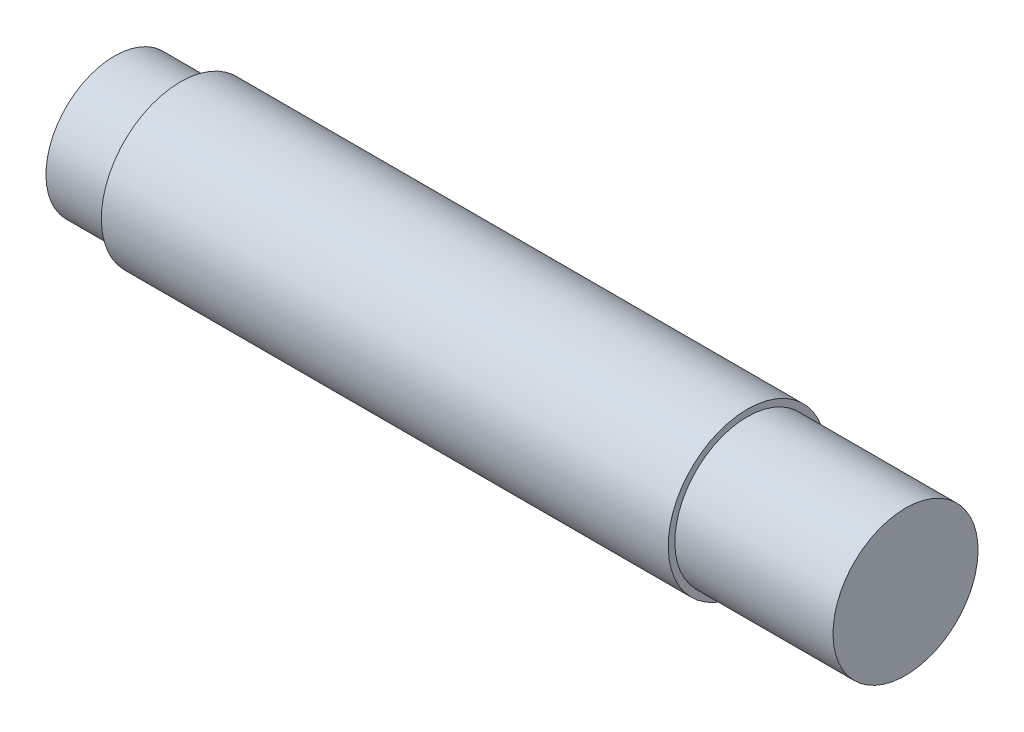
ISO-10303-21;
HEADER;
FILE_DESCRIPTION(('STEP AP214'),'2;1');
FILE_NAME('part.step','',(''),(''),'','','');
FILE_SCHEMA(('AUTOMOTIVE_DESIGN { 1 0 10303 214 1 1 1 1 }'));
ENDSEC;
DATA;
#1=APPLICATION_CONTEXT('core data for automotive mechanical design processes');
#2=APPLICATION_PROTOCOL_DEFINITION('international standard','automotive_design',2000,#1);
#3=PRODUCT_CONTEXT('',#1,'mechanical');
#4=PRODUCT('Part','Part','',(#3));
#5=PRODUCT_RELATED_PRODUCT_CATEGORY('part','',(#4));
#6=PRODUCT_DEFINITION_FORMATION('','',#4);
#7=PRODUCT_DEFINITION_CONTEXT('part definition',#1,'design');
#8=PRODUCT_DEFINITION('design','',#6,#7);
#9=PRODUCT_DEFINITION_SHAPE('','',#8);
#10=(LENGTH_UNIT() NAMED_UNIT(*) SI_UNIT(.MILLI.,.METRE.));
#11=(NAMED_UNIT(*) PLANE_ANGLE_UNIT() SI_UNIT($,.RADIAN.));
#12=(NAMED_UNIT(*) SI_UNIT($,.STERADIAN.) SOLID_ANGLE_UNIT());
#13=UNCERTAINTY_MEASURE_WITH_UNIT(LENGTH_MEASURE(1.E-05),#10,'distance_accuracy_value','');
#14=(GEOMETRIC_REPRESENTATION_CONTEXT(3) GLOBAL_UNCERTAINTY_ASSIGNED_CONTEXT((#13)) GLOBAL_UNIT_ASSIGNED_CONTEXT((#10,
#11,#12)) REPRESENTATION_CONTEXT('',''));
#15=CARTESIAN_POINT('',(0.,0.,0.));
#16=DIRECTION('',(0.,0.,1.));
#17=DIRECTION('',(1.,0.,0.));
#18=AXIS2_PLACEMENT_3D('',#15,#16,#17);
#19=CARTESIAN_POINT('',(0.,5.2,0.));
#20=DIRECTION('',(-1.,0.,0.));
#21=DIRECTION('',(0.,0.707106781186548,0.707106781186548));
#22=AXIS2_PLACEMENT_3D('',#19,#20,#21);
#23=PLANE('',#22);
#24=CARTESIAN_POINT('',(0.,0.,0.));
#25=DIRECTION('',(1.,0.,0.));
#26=DIRECTION('',(0.,0.,-1.));
#27=AXIS2_PLACEMENT_3D('',#24,#25,#26);
#28=CIRCLE('',#27,5.2);
#29=CARTESIAN_POINT('',(0.,5.2,0.));
#30=VERTEX_POINT('',#29);
#31=EDGE_CURVE('E11',#30,#30,#28,.T.);
#32=ORIENTED_EDGE('',*,*,#31,.F.);
#33=EDGE_LOOP('',(#32));
#34=FACE_BOUND('',#33,.T.);
#35=ADVANCED_FACE('F17',(#34),#23,.T.);
#36=CARTESIAN_POINT('',(2.5,0.,0.));
#37=DIRECTION('',(1.,0.,0.));
#38=DIRECTION('',(0.,1.,0.));
#39=AXIS2_PLACEMENT_3D('',#36,#37,#38);
#40=CYLINDRICAL_SURFACE('',#39,5.2);
#41=ORIENTED_EDGE('',*,*,#31,.T.);
#42=EDGE_LOOP('',(#41));
#43=FACE_BOUND('',#42,.T.);
#44=CARTESIAN_POINT('',(5.,0.,0.));
#45=DIRECTION('',(1.,0.,0.));
#46=DIRECTION('',(0.,0.,-1.));
#47=AXIS2_PLACEMENT_3D('',#44,#45,#46);
#48=CIRCLE('',#47,5.2);
#49=CARTESIAN_POINT('',(5.,5.2,0.));
#50=VERTEX_POINT('',#49);
#51=EDGE_CURVE('E27',#50,#50,#48,.T.);
#52=ORIENTED_EDGE('',*,*,#51,.F.);
#53=EDGE_LOOP('',(#52));
#54=FACE_BOUND('',#53,.T.);
#55=ADVANCED_FACE('F64',(#43,#54),#40,.T.);
#56=CARTESIAN_POINT('',(5.,6.,0.));
#57=DIRECTION('',(-1.,0.,0.));
#58=DIRECTION('',(0.,0.707106781186548,0.707106781186548));
#59=AXIS2_PLACEMENT_3D('',#56,#57,#58);
#60=PLANE('',#59);
#61=ORIENTED_EDGE('',*,*,#51,.T.);
#62=EDGE_LOOP('',(#61));
#63=FACE_BOUND('',#62,.T.);
#64=CARTESIAN_POINT('',(5.,0.,0.));
#65=DIRECTION('',(1.,0.,0.));
#66=DIRECTION('',(0.,0.,-1.));
#67=AXIS2_PLACEMENT_3D('',#64,#65,#66);
#68=CIRCLE('',#67,6.);
#69=CARTESIAN_POINT('',(5.,6.,0.));
#70=VERTEX_POINT('',#69);
#71=EDGE_CURVE('E54',#70,#70,#68,.T.);
#72=ORIENTED_EDGE('',*,*,#71,.F.);
#73=EDGE_LOOP('',(#72));
#74=FACE_BOUND('',#73,.T.);
#75=ADVANCED_FACE('F61',(#63,#74),#60,.T.);
#76=CARTESIAN_POINT('',(26.5,0.,0.));
#77=DIRECTION('',(1.,0.,0.));
#78=DIRECTION('',(0.,1.,0.));
#79=AXIS2_PLACEMENT_3D('',#76,#77,#78);
#80=CYLINDRICAL_SURFACE('',#79,6.);
#81=ORIENTED_EDGE('',*,*,#71,.T.);
#82=EDGE_LOOP('',(#81));
#83=FACE_BOUND('',#82,.T.);
#84=CARTESIAN_POINT('',(48.,0.,0.));
#85=DIRECTION('',(1.,0.,0.));
#86=DIRECTION('',(0.,0.,-1.));
#87=AXIS2_PLACEMENT_3D('',#84,#85,#86);
#88=CIRCLE('',#87,6.);
#89=CARTESIAN_POINT('',(48.,6.,0.));
#90=VERTEX_POINT('',#89);
#91=EDGE_CURVE('E51',#90,#90,#88,.T.);
#92=ORIENTED_EDGE('',*,*,#91,.F.);
#93=EDGE_LOOP('',(#92));
#94=FACE_BOUND('',#93,.T.);
#95=ADVANCED_FACE('F73',(#83,#94),#80,.T.);
#96=CARTESIAN_POINT('',(48.,5.5,0.));
#97=DIRECTION('',(1.,0.,0.));
#98=DIRECTION('',(0.,0.707106781186548,0.707106781186548));
#99=AXIS2_PLACEMENT_3D('',#96,#97,#98);
#100=PLANE('',#99);
#101=ORIENTED_EDGE('',*,*,#91,.T.);
#102=EDGE_LOOP('',(#101));
#103=FACE_BOUND('',#102,.T.);
#104=CARTESIAN_POINT('',(48.,0.,0.));
#105=DIRECTION('',(1.,0.,0.));
#106=DIRECTION('',(0.,0.,-1.));
#107=AXIS2_PLACEMENT_3D('',#104,#105,#106);
#108=CIRCLE('',#107,5.5);
#109=CARTESIAN_POINT('',(48.,5.5,0.));
#110=VERTEX_POINT('',#109);
#111=EDGE_CURVE('E45',#110,#110,#108,.T.);
#112=ORIENTED_EDGE('',*,*,#111,.F.);
#113=EDGE_LOOP('',(#112));
#114=FACE_BOUND('',#113,.T.);
#115=ADVANCED_FACE('F79',(#103,#114),#100,.T.);
#116=CARTESIAN_POINT('',(54.,0.,0.));
#117=DIRECTION('',(1.,0.,0.));
#118=DIRECTION('',(0.,1.,0.));
#119=AXIS2_PLACEMENT_3D('',#116,#117,#118);
#120=CYLINDRICAL_SURFACE('',#119,5.5);
#121=ORIENTED_EDGE('',*,*,#111,.T.);
#122=EDGE_LOOP('',(#121));
#123=FACE_BOUND('',#122,.T.);
#124=CARTESIAN_POINT('',(60.,0.,0.));
#125=DIRECTION('',(1.,0.,0.));
#126=DIRECTION('',(0.,0.,-1.));
#127=AXIS2_PLACEMENT_3D('',#124,#125,#126);
#128=CIRCLE('',#127,5.5);
#129=CARTESIAN_POINT('',(60.,5.5,0.));
#130=VERTEX_POINT('',#129);
#131=EDGE_CURVE('E21',#130,#130,#128,.T.);
#132=ORIENTED_EDGE('',*,*,#131,.F.);
#133=EDGE_LOOP('',(#132));
#134=FACE_BOUND('',#133,.T.);
#135=ADVANCED_FACE('F49',(#123,#134),#120,.T.);
#136=CARTESIAN_POINT('',(60.,0.,0.));
#137=DIRECTION('',(1.,0.,0.));
#138=DIRECTION('',(0.,0.707106781186548,0.707106781186548));
#139=AXIS2_PLACEMENT_3D('',#136,#137,#138);
#140=PLANE('',#139);
#141=ORIENTED_EDGE('',*,*,#131,.T.);
#142=EDGE_LOOP('',(#141));
#143=FACE_BOUND('',#142,.T.);
#144=ADVANCED_FACE('F19',(#143),#140,.T.);
#145=CLOSED_SHELL('',(#35,#55,#75,#95,#115,#135,#144));
#146=MANIFOLD_SOLID_BREP('B1',#145);
#147=ADVANCED_BREP_SHAPE_REPRESENTATION('',(#18,#146),#14);
#148=SHAPE_DEFINITION_REPRESENTATION(#9,#147);
ENDSEC;
END-ISO-10303-21;
